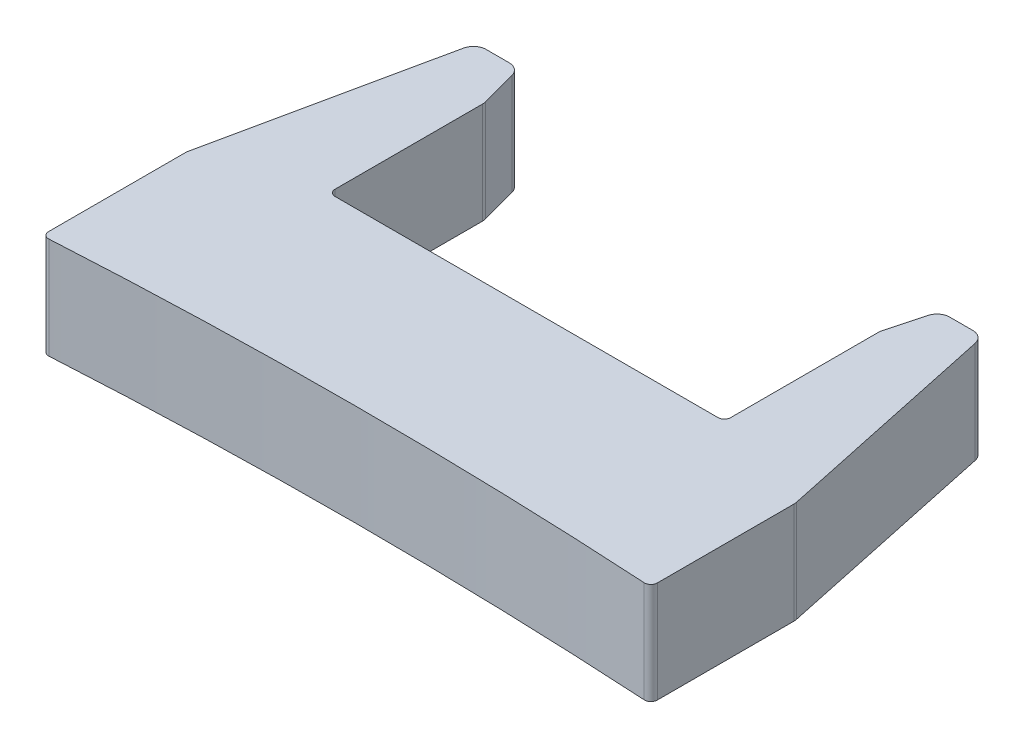
ISO-10303-21;
HEADER;
FILE_DESCRIPTION(('STEP AP214'),'2;1');
FILE_NAME('part.step','',(''),(''),'','','');
FILE_SCHEMA(('AUTOMOTIVE_DESIGN { 1 0 10303 214 1 1 1 1 }'));
ENDSEC;
DATA;
#1=APPLICATION_CONTEXT('core data for automotive mechanical design processes');
#2=APPLICATION_PROTOCOL_DEFINITION('international standard','automotive_design',2000,#1);
#3=PRODUCT_CONTEXT('',#1,'mechanical');
#4=PRODUCT('Part','Part','',(#3));
#5=PRODUCT_RELATED_PRODUCT_CATEGORY('part','',(#4));
#6=PRODUCT_DEFINITION_FORMATION('','',#4);
#7=PRODUCT_DEFINITION_CONTEXT('part definition',#1,'design');
#8=PRODUCT_DEFINITION('design','',#6,#7);
#9=PRODUCT_DEFINITION_SHAPE('','',#8);
#10=(LENGTH_UNIT() NAMED_UNIT(*) SI_UNIT(.MILLI.,.METRE.));
#11=(NAMED_UNIT(*) PLANE_ANGLE_UNIT() SI_UNIT($,.RADIAN.));
#12=(NAMED_UNIT(*) SI_UNIT($,.STERADIAN.) SOLID_ANGLE_UNIT());
#13=UNCERTAINTY_MEASURE_WITH_UNIT(LENGTH_MEASURE(1.E-05),#10,'distance_accuracy_value','');
#14=(GEOMETRIC_REPRESENTATION_CONTEXT(3) GLOBAL_UNCERTAINTY_ASSIGNED_CONTEXT((#13)) GLOBAL_UNIT_ASSIGNED_CONTEXT((#10,
#11,#12)) REPRESENTATION_CONTEXT('',''));
#15=CARTESIAN_POINT('',(0.,0.,0.));
#16=DIRECTION('',(0.,0.,1.));
#17=DIRECTION('',(1.,0.,0.));
#18=AXIS2_PLACEMENT_3D('',#15,#16,#17);
#19=CARTESIAN_POINT('',(-20.,4.,0.));
#20=DIRECTION('',(0.,0.,1.));
#21=DIRECTION('',(1.,0.,0.));
#22=AXIS2_PLACEMENT_3D('',#19,#20,#21);
#23=PLANE('',#22);
#24=CARTESIAN_POINT('',(0.,0.,0.));
#25=DIRECTION('',(0.,0.,-1.));
#26=DIRECTION('',(-1.,0.,0.));
#27=AXIS2_PLACEMENT_3D('',#24,#25,#26);
#28=CIRCLE('',#27,2.49999999999999);
#29=CARTESIAN_POINT('',(-2.49999999999999,0.,0.));
#30=VERTEX_POINT('',#29);
#31=EDGE_CURVE('E221',#30,#30,#28,.T.);
#32=ORIENTED_EDGE('',*,*,#31,.F.);
#33=EDGE_LOOP('',(#32));
#34=FACE_BOUND('',#33,.T.);
#35=DIRECTION('',(-1.,0.,0.));
#36=VECTOR('',#35,1.);
#37=CARTESIAN_POINT('',(-20.,-4.,0.));
#38=LINE('',#37,#36);
#39=CARTESIAN_POINT('',(15.1,-4.,0.));
#40=VERTEX_POINT('',#39);
#41=CARTESIAN_POINT('',(-15.1,-4.,0.));
#42=VERTEX_POINT('',#41);
#43=EDGE_CURVE('E263',#40,#42,#38,.T.);
#44=ORIENTED_EDGE('',*,*,#43,.T.);
#45=DIRECTION('',(0.,1.,0.));
#46=VECTOR('',#45,1.);
#47=CARTESIAN_POINT('',(-15.1,4.,0.));
#48=LINE('',#47,#46);
#49=CARTESIAN_POINT('',(-15.1,4.,0.));
#50=VERTEX_POINT('',#49);
#51=EDGE_CURVE('E385',#42,#50,#48,.T.);
#52=ORIENTED_EDGE('',*,*,#51,.T.);
#53=DIRECTION('',(-1.,0.,0.));
#54=VECTOR('',#53,1.);
#55=CARTESIAN_POINT('',(0.,4.,0.));
#56=LINE('',#55,#54);
#57=CARTESIAN_POINT('',(15.1,4.,0.));
#58=VERTEX_POINT('',#57);
#59=EDGE_CURVE('E269',#58,#50,#56,.T.);
#60=ORIENTED_EDGE('',*,*,#59,.F.);
#61=DIRECTION('',(0.,1.,0.));
#62=VECTOR('',#61,1.);
#63=CARTESIAN_POINT('',(15.1,4.,0.));
#64=LINE('',#63,#62);
#65=EDGE_CURVE('E383',#58,#40,#64,.F.);
#66=ORIENTED_EDGE('',*,*,#65,.T.);
#67=EDGE_LOOP('',(#44,#52,#60,#66));
#68=FACE_BOUND('',#67,.T.);
#69=ADVANCED_FACE('F48',(#34,#68),#23,.F.);
#70=CARTESIAN_POINT('',(-24.,4.,2.8));
#71=DIRECTION('',(1.,0.,0.));
#72=DIRECTION('',(0.,0.,-1.));
#73=AXIS2_PLACEMENT_3D('',#70,#71,#72);
#74=PLANE('',#73);
#75=DIRECTION('',(0.,0.,1.));
#76=VECTOR('',#75,1.);
#77=CARTESIAN_POINT('',(-24.,-4.,2.8));
#78=LINE('',#77,#76);
#79=CARTESIAN_POINT('',(-24.,-4.,2.90520551069358));
#80=VERTEX_POINT('',#79);
#81=CARTESIAN_POINT('',(-24.,-4.,13.6900451464471));
#82=VERTEX_POINT('',#81);
#83=EDGE_CURVE('E290',#80,#82,#78,.T.);
#84=ORIENTED_EDGE('',*,*,#83,.T.);
#85=DIRECTION('',(0.,-1.,0.));
#86=VECTOR('',#85,1.);
#87=CARTESIAN_POINT('',(-24.,4.,13.6900451464471));
#88=LINE('',#87,#86);
#89=CARTESIAN_POINT('',(-24.,4.,13.6900451464471));
#90=VERTEX_POINT('',#89);
#91=EDGE_CURVE('E399',#82,#90,#88,.F.);
#92=ORIENTED_EDGE('',*,*,#91,.T.);
#93=DIRECTION('',(0.,0.,1.));
#94=VECTOR('',#93,1.);
#95=CARTESIAN_POINT('',(-24.,4.,2.8));
#96=LINE('',#95,#94);
#97=CARTESIAN_POINT('',(-24.,4.,2.90520551069358));
#98=VERTEX_POINT('',#97);
#99=EDGE_CURVE('E273',#98,#90,#96,.T.);
#100=ORIENTED_EDGE('',*,*,#99,.F.);
#101=DIRECTION('',(0.,-1.,0.));
#102=VECTOR('',#101,1.);
#103=CARTESIAN_POINT('',(-24.,-4.,2.90520551069358));
#104=LINE('',#103,#102);
#105=EDGE_CURVE('E356',#98,#80,#104,.T.);
#106=ORIENTED_EDGE('',*,*,#105,.T.);
#107=EDGE_LOOP('',(#84,#92,#100,#106));
#108=FACE_BOUND('',#107,.T.);
#109=ADVANCED_FACE('F479',(#108),#74,.F.);
#110=CARTESIAN_POINT('',(0.,4.,413.5));
#111=DIRECTION('',(0.,-1.,0.));
#112=DIRECTION('',(0.,0.,-1.));
#113=AXIS2_PLACEMENT_3D('',#110,#111,#112);
#114=CYLINDRICAL_SURFACE('',#113,400.);
#115=CARTESIAN_POINT('',(0.,4.,413.5));
#116=DIRECTION('',(0.,-1.,0.));
#117=DIRECTION('',(0.,0.,-1.));
#118=AXIS2_PLACEMENT_3D('',#115,#116,#117);
#119=CIRCLE('',#118,400.);
#120=CARTESIAN_POINT('',(-23.4706616729089,4.,14.1891836668636));
#121=VERTEX_POINT('',#120);
#122=CARTESIAN_POINT('',(23.4706616729089,4.,14.1891836668636));
#123=VERTEX_POINT('',#122);
#124=EDGE_CURVE('E278',#121,#123,#119,.T.);
#125=ORIENTED_EDGE('',*,*,#124,.F.);
#126=DIRECTION('',(0.,-1.,0.));
#127=VECTOR('',#126,1.);
#128=CARTESIAN_POINT('',(-23.4706616729089,4.,14.1891836668636));
#129=LINE('',#128,#127);
#130=CARTESIAN_POINT('',(-23.4706616729089,-4.,14.1891836668636));
#131=VERTEX_POINT('',#130);
#132=EDGE_CURVE('E392',#121,#131,#129,.T.);
#133=ORIENTED_EDGE('',*,*,#132,.T.);
#134=CARTESIAN_POINT('',(0.,-4.,413.5));
#135=DIRECTION('',(0.,-1.,0.));
#136=DIRECTION('',(0.,0.,-1.));
#137=AXIS2_PLACEMENT_3D('',#134,#135,#136);
#138=CIRCLE('',#137,400.);
#139=CARTESIAN_POINT('',(23.4706616729089,-4.,14.1891836668636));
#140=VERTEX_POINT('',#139);
#141=EDGE_CURVE('E293',#131,#140,#138,.T.);
#142=ORIENTED_EDGE('',*,*,#141,.T.);
#143=DIRECTION('',(0.,-1.,0.));
#144=VECTOR('',#143,1.);
#145=CARTESIAN_POINT('',(23.4706616729089,4.,14.1891836668636));
#146=LINE('',#145,#144);
#147=EDGE_CURVE('E390',#140,#123,#146,.F.);
#148=ORIENTED_EDGE('',*,*,#147,.T.);
#149=EDGE_LOOP('',(#125,#133,#142,#148));
#150=FACE_BOUND('',#149,.T.);
#151=ADVANCED_FACE('F485',(#150),#114,.F.);
#152=CARTESIAN_POINT('',(24.,4.,2.8));
#153=DIRECTION('',(-1.,0.,0.));
#154=DIRECTION('',(0.,0.,1.));
#155=AXIS2_PLACEMENT_3D('',#152,#153,#154);
#156=PLANE('',#155);
#157=DIRECTION('',(0.,0.,-1.));
#158=VECTOR('',#157,1.);
#159=CARTESIAN_POINT('',(24.,4.,2.8));
#160=LINE('',#159,#158);
#161=CARTESIAN_POINT('',(24.,4.,13.6900451464471));
#162=VERTEX_POINT('',#161);
#163=CARTESIAN_POINT('',(24.,4.,2.90520551069359));
#164=VERTEX_POINT('',#163);
#165=EDGE_CURVE('E284',#162,#164,#160,.T.);
#166=ORIENTED_EDGE('',*,*,#165,.F.);
#167=DIRECTION('',(0.,-1.,0.));
#168=VECTOR('',#167,1.);
#169=CARTESIAN_POINT('',(24.,4.,13.6900451464471));
#170=LINE('',#169,#168);
#171=CARTESIAN_POINT('',(24.,-4.,13.6900451464471));
#172=VERTEX_POINT('',#171);
#173=EDGE_CURVE('E403',#162,#172,#170,.T.);
#174=ORIENTED_EDGE('',*,*,#173,.T.);
#175=DIRECTION('',(0.,0.,-1.));
#176=VECTOR('',#175,1.);
#177=CARTESIAN_POINT('',(24.,-4.,2.8));
#178=LINE('',#177,#176);
#179=CARTESIAN_POINT('',(24.,-4.,2.90520551069359));
#180=VERTEX_POINT('',#179);
#181=EDGE_CURVE('E274',#172,#180,#178,.T.);
#182=ORIENTED_EDGE('',*,*,#181,.T.);
#183=DIRECTION('',(0.,-1.,0.));
#184=VECTOR('',#183,1.);
#185=CARTESIAN_POINT('',(24.,4.,2.90520551069359));
#186=LINE('',#185,#184);
#187=EDGE_CURVE('E353',#180,#164,#186,.F.);
#188=ORIENTED_EDGE('',*,*,#187,.T.);
#189=EDGE_LOOP('',(#166,#174,#182,#188));
#190=FACE_BOUND('',#189,.T.);
#191=ADVANCED_FACE('F711',(#190),#156,.F.);
#192=CARTESIAN_POINT('',(0.,4.,413.5));
#193=DIRECTION('',(0.,-1.,0.));
#194=DIRECTION('',(0.,0.,-1.));
#195=AXIS2_PLACEMENT_3D('',#192,#193,#194);
#196=PLANE('',#195);
#197=ORIENTED_EDGE('',*,*,#99,.T.);
#198=CARTESIAN_POINT('',(-23.5,4.,13.6900451464471));
#199=DIRECTION('',(0.,-1.,0.));
#200=DIRECTION('',(0.,0.,-1.));
#201=AXIS2_PLACEMENT_3D('',#198,#199,#200);
#202=CIRCLE('',#201,0.5);
#203=EDGE_CURVE('E402',#90,#121,#202,.F.);
#204=ORIENTED_EDGE('',*,*,#203,.T.);
#205=ORIENTED_EDGE('',*,*,#124,.T.);
#206=CARTESIAN_POINT('',(23.5,4.,13.6900451464471));
#207=DIRECTION('',(0.,-1.,0.));
#208=DIRECTION('',(0.,0.,-1.));
#209=AXIS2_PLACEMENT_3D('',#206,#207,#208);
#210=CIRCLE('',#209,0.5);
#211=EDGE_CURVE('E63',#123,#162,#210,.F.);
#212=ORIENTED_EDGE('',*,*,#211,.T.);
#213=ORIENTED_EDGE('',*,*,#165,.T.);
#214=CARTESIAN_POINT('',(23.,4.,2.90520551069359));
#215=DIRECTION('',(0.,-1.,0.));
#216=DIRECTION('',(0.,0.,-1.));
#217=AXIS2_PLACEMENT_3D('',#214,#215,#216);
#218=CIRCLE('',#217,1.);
#219=CARTESIAN_POINT('',(23.9781059289848,4.,2.69709786622873));
#220=VERTEX_POINT('',#219);
#221=EDGE_CURVE('E326',#164,#220,#218,.F.);
#222=ORIENTED_EDGE('',*,*,#221,.T.);
#223=DIRECTION('',(-0.208107644464859,0.,-0.978105928984835));
#224=VECTOR('',#223,1.);
#225=CARTESIAN_POINT('',(20.,4.,-16.));
#226=LINE('',#225,#224);
#227=CARTESIAN_POINT('',(20.1684877352202,4.,-15.2081076444649));
#228=VERTEX_POINT('',#227);
#229=EDGE_CURVE('E220',#220,#228,#226,.T.);
#230=ORIENTED_EDGE('',*,*,#229,.T.);
#231=CARTESIAN_POINT('',(19.1903818062354,4.,-15.));
#232=DIRECTION('',(0.,-1.,0.));
#233=DIRECTION('',(0.,0.,-1.));
#234=AXIS2_PLACEMENT_3D('',#231,#232,#233);
#235=CIRCLE('',#234,1.);
#236=CARTESIAN_POINT('',(19.1903818062354,4.,-16.));
#237=VERTEX_POINT('',#236);
#238=EDGE_CURVE('E328',#228,#237,#235,.F.);
#239=ORIENTED_EDGE('',*,*,#238,.T.);
#240=DIRECTION('',(-1.,0.,0.));
#241=VECTOR('',#240,1.);
#242=CARTESIAN_POINT('',(20.,4.,-16.));
#243=LINE('',#242,#241);
#244=CARTESIAN_POINT('',(17.367326987979,4.,-16.));
#245=VERTEX_POINT('',#244);
#246=EDGE_CURVE('E224',#237,#245,#243,.T.);
#247=ORIENTED_EDGE('',*,*,#246,.T.);
#248=CARTESIAN_POINT('',(17.367326987979,4.,-15.));
#249=DIRECTION('',(0.,-1.,0.));
#250=DIRECTION('',(0.,0.,-1.));
#251=AXIS2_PLACEMENT_3D('',#248,#249,#250);
#252=CIRCLE('',#251,1.);
#253=CARTESIAN_POINT('',(16.4014011616899,4.,-15.2588190451025));
#254=VERTEX_POINT('',#253);
#255=EDGE_CURVE('E320',#245,#254,#252,.F.);
#256=ORIENTED_EDGE('',*,*,#255,.T.);
#257=DIRECTION('',(0.258819045102521,0.,-0.965925826289068));
#258=VECTOR('',#257,1.);
#259=CARTESIAN_POINT('',(16.6,4.,-16.));
#260=LINE('',#259,#258);
#261=CARTESIAN_POINT('',(15.6340741737109,4.,-12.3951157399463));
#262=VERTEX_POINT('',#261);
#263=EDGE_CURVE('E299',#254,#262,#260,.F.);
#264=ORIENTED_EDGE('',*,*,#263,.T.);
#265=CARTESIAN_POINT('',(16.6,4.,-12.1362966948437));
#266=DIRECTION('',(0.,-1.,0.));
#267=DIRECTION('',(0.,0.,-1.));
#268=AXIS2_PLACEMENT_3D('',#265,#266,#267);
#269=CIRCLE('',#268,1.);
#270=CARTESIAN_POINT('',(15.6,4.,-12.1362966948437));
#271=VERTEX_POINT('',#270);
#272=EDGE_CURVE('E318',#262,#271,#269,.F.);
#273=ORIENTED_EDGE('',*,*,#272,.T.);
#274=DIRECTION('',(0.,0.,1.));
#275=VECTOR('',#274,1.);
#276=CARTESIAN_POINT('',(15.6,4.,-16.));
#277=LINE('',#276,#275);
#278=CARTESIAN_POINT('',(15.6,4.,-0.5));
#279=VERTEX_POINT('',#278);
#280=EDGE_CURVE('E229',#271,#279,#277,.T.);
#281=ORIENTED_EDGE('',*,*,#280,.T.);
#282=CARTESIAN_POINT('',(15.1,4.,-0.5));
#283=DIRECTION('',(0.,-1.,0.));
#284=DIRECTION('',(0.,0.,-1.));
#285=AXIS2_PLACEMENT_3D('',#282,#283,#284);
#286=CIRCLE('',#285,0.5);
#287=EDGE_CURVE('E56',#279,#58,#286,.T.);
#288=ORIENTED_EDGE('',*,*,#287,.T.);
#289=ORIENTED_EDGE('',*,*,#59,.T.);
#290=CARTESIAN_POINT('',(-15.1,4.,-0.5));
#291=DIRECTION('',(0.,-1.,0.));
#292=DIRECTION('',(0.,0.,-1.));
#293=AXIS2_PLACEMENT_3D('',#290,#291,#292);
#294=CIRCLE('',#293,0.5);
#295=CARTESIAN_POINT('',(-15.6,4.,-0.5));
#296=VERTEX_POINT('',#295);
#297=EDGE_CURVE('E246',#50,#296,#294,.T.);
#298=ORIENTED_EDGE('',*,*,#297,.T.);
#299=DIRECTION('',(0.,0.,-1.));
#300=VECTOR('',#299,1.);
#301=CARTESIAN_POINT('',(-15.6,4.,-16.));
#302=LINE('',#301,#300);
#303=CARTESIAN_POINT('',(-15.6,4.,-12.1362966948437));
#304=VERTEX_POINT('',#303);
#305=EDGE_CURVE('E254',#296,#304,#302,.T.);
#306=ORIENTED_EDGE('',*,*,#305,.T.);
#307=CARTESIAN_POINT('',(-16.6,4.,-12.1362966948437));
#308=DIRECTION('',(0.,-1.,0.));
#309=DIRECTION('',(0.,0.,-1.));
#310=AXIS2_PLACEMENT_3D('',#307,#308,#309);
#311=CIRCLE('',#310,1.);
#312=CARTESIAN_POINT('',(-15.6340741737109,4.,-12.3951157399463));
#313=VERTEX_POINT('',#312);
#314=EDGE_CURVE('E316',#304,#313,#311,.F.);
#315=ORIENTED_EDGE('',*,*,#314,.T.);
#316=DIRECTION('',(0.258819045102521,0.,0.965925826289068));
#317=VECTOR('',#316,1.);
#318=CARTESIAN_POINT('',(-15.6,4.,-12.2679491924311));
#319=LINE('',#318,#317);
#320=CARTESIAN_POINT('',(-16.4014011616899,4.,-15.2588190451025));
#321=VERTEX_POINT('',#320);
#322=EDGE_CURVE('E287',#313,#321,#319,.F.);
#323=ORIENTED_EDGE('',*,*,#322,.T.);
#324=CARTESIAN_POINT('',(-17.367326987979,4.,-15.));
#325=DIRECTION('',(0.,-1.,0.));
#326=DIRECTION('',(0.,0.,-1.));
#327=AXIS2_PLACEMENT_3D('',#324,#325,#326);
#328=CIRCLE('',#327,1.);
#329=CARTESIAN_POINT('',(-17.367326987979,4.,-16.));
#330=VERTEX_POINT('',#329);
#331=EDGE_CURVE('E314',#321,#330,#328,.F.);
#332=ORIENTED_EDGE('',*,*,#331,.T.);
#333=DIRECTION('',(-1.,0.,0.));
#334=VECTOR('',#333,1.);
#335=CARTESIAN_POINT('',(-20.,4.,-16.));
#336=LINE('',#335,#334);
#337=CARTESIAN_POINT('',(-19.1903818062354,4.,-16.));
#338=VERTEX_POINT('',#337);
#339=EDGE_CURVE('E257',#330,#338,#336,.T.);
#340=ORIENTED_EDGE('',*,*,#339,.T.);
#341=CARTESIAN_POINT('',(-19.1903818062354,4.,-15.));
#342=DIRECTION('',(0.,-1.,0.));
#343=DIRECTION('',(0.,0.,-1.));
#344=AXIS2_PLACEMENT_3D('',#341,#342,#343);
#345=CIRCLE('',#344,1.);
#346=CARTESIAN_POINT('',(-20.1684877352202,4.,-15.2081076444649));
#347=VERTEX_POINT('',#346);
#348=EDGE_CURVE('E322',#338,#347,#345,.F.);
#349=ORIENTED_EDGE('',*,*,#348,.T.);
#350=DIRECTION('',(-0.208107644464859,0.,0.978105928984835));
#351=VECTOR('',#350,1.);
#352=CARTESIAN_POINT('',(-20.,4.,-16.));
#353=LINE('',#352,#351);
#354=CARTESIAN_POINT('',(-23.9781059289848,4.,2.69709786622873));
#355=VERTEX_POINT('',#354);
#356=EDGE_CURVE('E268',#347,#355,#353,.T.);
#357=ORIENTED_EDGE('',*,*,#356,.T.);
#358=CARTESIAN_POINT('',(-23.,4.,2.90520551069358));
#359=DIRECTION('',(0.,-1.,0.));
#360=DIRECTION('',(0.,0.,-1.));
#361=AXIS2_PLACEMENT_3D('',#358,#359,#360);
#362=CIRCLE('',#361,1.);
#363=EDGE_CURVE('E324',#355,#98,#362,.F.);
#364=ORIENTED_EDGE('',*,*,#363,.T.);
#365=EDGE_LOOP('',(#197,#204,#205,#212,#213,#222,#230,#239,#247,#256,#264,#273,#281,#288,#289,
#298,#306,#315,#323,#332,#340,#349,#357,#364));
#366=FACE_BOUND('',#365,.T.);
#367=ADVANCED_FACE('F414',(#366),#196,.F.);
#368=CARTESIAN_POINT('',(0.,-4.,413.5));
#369=DIRECTION('',(0.,-1.,0.));
#370=DIRECTION('',(0.,0.,-1.));
#371=AXIS2_PLACEMENT_3D('',#368,#369,#370);
#372=PLANE('',#371);
#373=ORIENTED_EDGE('',*,*,#141,.F.);
#374=CARTESIAN_POINT('',(-23.5,-4.,13.6900451464471));
#375=DIRECTION('',(0.,-1.,0.));
#376=DIRECTION('',(0.,0.,-1.));
#377=AXIS2_PLACEMENT_3D('',#374,#375,#376);
#378=CIRCLE('',#377,0.5);
#379=EDGE_CURVE('E397',#131,#82,#378,.T.);
#380=ORIENTED_EDGE('',*,*,#379,.T.);
#381=ORIENTED_EDGE('',*,*,#83,.F.);
#382=CARTESIAN_POINT('',(-23.,-4.,2.90520551069358));
#383=DIRECTION('',(0.,-1.,0.));
#384=DIRECTION('',(0.,0.,-1.));
#385=AXIS2_PLACEMENT_3D('',#382,#383,#384);
#386=CIRCLE('',#385,1.);
#387=CARTESIAN_POINT('',(-23.9781059289848,-4.,2.69709786622873));
#388=VERTEX_POINT('',#387);
#389=EDGE_CURVE('E346',#80,#388,#386,.T.);
#390=ORIENTED_EDGE('',*,*,#389,.T.);
#391=DIRECTION('',(-0.208107644464859,0.,0.978105928984835));
#392=VECTOR('',#391,1.);
#393=CARTESIAN_POINT('',(-20.,-4.,-16.));
#394=LINE('',#393,#392);
#395=CARTESIAN_POINT('',(-20.1684877352202,-4.,-15.2081076444649));
#396=VERTEX_POINT('',#395);
#397=EDGE_CURVE('E260',#396,#388,#394,.T.);
#398=ORIENTED_EDGE('',*,*,#397,.F.);
#399=CARTESIAN_POINT('',(-19.1903818062354,-4.,-15.));
#400=DIRECTION('',(0.,-1.,0.));
#401=DIRECTION('',(0.,0.,-1.));
#402=AXIS2_PLACEMENT_3D('',#399,#400,#401);
#403=CIRCLE('',#402,1.);
#404=CARTESIAN_POINT('',(-19.1903818062354,-4.,-16.));
#405=VERTEX_POINT('',#404);
#406=EDGE_CURVE('E344',#396,#405,#403,.T.);
#407=ORIENTED_EDGE('',*,*,#406,.T.);
#408=DIRECTION('',(-1.,0.,0.));
#409=VECTOR('',#408,1.);
#410=CARTESIAN_POINT('',(-20.,-4.,-16.));
#411=LINE('',#410,#409);
#412=CARTESIAN_POINT('',(-17.367326987979,-4.,-16.));
#413=VERTEX_POINT('',#412);
#414=EDGE_CURVE('E264',#413,#405,#411,.T.);
#415=ORIENTED_EDGE('',*,*,#414,.F.);
#416=CARTESIAN_POINT('',(-17.367326987979,-4.,-15.));
#417=DIRECTION('',(0.,-1.,0.));
#418=DIRECTION('',(0.,0.,-1.));
#419=AXIS2_PLACEMENT_3D('',#416,#417,#418);
#420=CIRCLE('',#419,1.);
#421=CARTESIAN_POINT('',(-16.4014011616899,-4.,-15.2588190451026));
#422=VERTEX_POINT('',#421);
#423=EDGE_CURVE('E335',#413,#422,#420,.T.);
#424=ORIENTED_EDGE('',*,*,#423,.T.);
#425=DIRECTION('',(-0.258819045102521,0.,-0.965925826289068));
#426=VECTOR('',#425,1.);
#427=CARTESIAN_POINT('',(91.8869891485892,-4.,388.878955462708));
#428=LINE('',#427,#426);
#429=CARTESIAN_POINT('',(-15.634074173711,-4.,-12.3951157399463));
#430=VERTEX_POINT('',#429);
#431=EDGE_CURVE('E302',#422,#430,#428,.F.);
#432=ORIENTED_EDGE('',*,*,#431,.T.);
#433=CARTESIAN_POINT('',(-16.6,-4.,-12.1362966948437));
#434=DIRECTION('',(0.,-1.,0.));
#435=DIRECTION('',(0.,0.,-1.));
#436=AXIS2_PLACEMENT_3D('',#433,#434,#435);
#437=CIRCLE('',#436,1.);
#438=CARTESIAN_POINT('',(-15.6,-4.,-12.1362966948437));
#439=VERTEX_POINT('',#438);
#440=EDGE_CURVE('E337',#430,#439,#437,.T.);
#441=ORIENTED_EDGE('',*,*,#440,.T.);
#442=DIRECTION('',(0.,0.,-1.));
#443=VECTOR('',#442,1.);
#444=CARTESIAN_POINT('',(-15.6,-4.,-16.));
#445=LINE('',#444,#443);
#446=CARTESIAN_POINT('',(-15.6,-4.,-0.5));
#447=VERTEX_POINT('',#446);
#448=EDGE_CURVE('E267',#447,#439,#445,.T.);
#449=ORIENTED_EDGE('',*,*,#448,.F.);
#450=CARTESIAN_POINT('',(-15.1,-4.,-0.5));
#451=DIRECTION('',(0.,-1.,0.));
#452=DIRECTION('',(0.,0.,-1.));
#453=AXIS2_PLACEMENT_3D('',#450,#451,#452);
#454=CIRCLE('',#453,0.5);
#455=EDGE_CURVE('E244',#447,#42,#454,.F.);
#456=ORIENTED_EDGE('',*,*,#455,.T.);
#457=ORIENTED_EDGE('',*,*,#43,.F.);
#458=CARTESIAN_POINT('',(15.1,-4.,-0.5));
#459=DIRECTION('',(0.,-1.,0.));
#460=DIRECTION('',(0.,0.,-1.));
#461=AXIS2_PLACEMENT_3D('',#458,#459,#460);
#462=CIRCLE('',#461,0.5);
#463=CARTESIAN_POINT('',(15.6,-4.,-0.5));
#464=VERTEX_POINT('',#463);
#465=EDGE_CURVE('E12',#40,#464,#462,.F.);
#466=ORIENTED_EDGE('',*,*,#465,.T.);
#467=DIRECTION('',(0.,0.,1.));
#468=VECTOR('',#467,1.);
#469=CARTESIAN_POINT('',(15.6,-4.,-16.));
#470=LINE('',#469,#468);
#471=CARTESIAN_POINT('',(15.6,-4.,-12.1362966948437));
#472=VERTEX_POINT('',#471);
#473=EDGE_CURVE('E258',#472,#464,#470,.T.);
#474=ORIENTED_EDGE('',*,*,#473,.F.);
#475=CARTESIAN_POINT('',(16.6,-4.,-12.1362966948437));
#476=DIRECTION('',(0.,-1.,0.));
#477=DIRECTION('',(0.,0.,-1.));
#478=AXIS2_PLACEMENT_3D('',#475,#476,#477);
#479=CIRCLE('',#478,1.);
#480=CARTESIAN_POINT('',(15.634074173711,-4.,-12.3951157399463));
#481=VERTEX_POINT('',#480);
#482=EDGE_CURVE('E340',#472,#481,#479,.T.);
#483=ORIENTED_EDGE('',*,*,#482,.T.);
#484=DIRECTION('',(-0.258819045102521,0.,0.965925826289068));
#485=VECTOR('',#484,1.);
#486=CARTESIAN_POINT('',(-91.8869891485892,-4.,388.878955462708));
#487=LINE('',#486,#485);
#488=CARTESIAN_POINT('',(16.4014011616899,-4.,-15.2588190451026));
#489=VERTEX_POINT('',#488);
#490=EDGE_CURVE('E305',#481,#489,#487,.F.);
#491=ORIENTED_EDGE('',*,*,#490,.T.);
#492=CARTESIAN_POINT('',(17.367326987979,-4.,-15.));
#493=DIRECTION('',(0.,-1.,0.));
#494=DIRECTION('',(0.,0.,-1.));
#495=AXIS2_PLACEMENT_3D('',#492,#493,#494);
#496=CIRCLE('',#495,1.);
#497=CARTESIAN_POINT('',(17.367326987979,-4.,-16.));
#498=VERTEX_POINT('',#497);
#499=EDGE_CURVE('E342',#489,#498,#496,.T.);
#500=ORIENTED_EDGE('',*,*,#499,.T.);
#501=DIRECTION('',(-1.,0.,0.));
#502=VECTOR('',#501,1.);
#503=CARTESIAN_POINT('',(20.,-4.,-16.));
#504=LINE('',#503,#502);
#505=CARTESIAN_POINT('',(19.1903818062354,-4.,-16.));
#506=VERTEX_POINT('',#505);
#507=EDGE_CURVE('E426',#506,#498,#504,.T.);
#508=ORIENTED_EDGE('',*,*,#507,.F.);
#509=CARTESIAN_POINT('',(19.1903818062354,-4.,-15.));
#510=DIRECTION('',(0.,-1.,0.));
#511=DIRECTION('',(0.,0.,-1.));
#512=AXIS2_PLACEMENT_3D('',#509,#510,#511);
#513=CIRCLE('',#512,1.);
#514=CARTESIAN_POINT('',(20.1684877352202,-4.,-15.2081076444649));
#515=VERTEX_POINT('',#514);
#516=EDGE_CURVE('E351',#506,#515,#513,.T.);
#517=ORIENTED_EDGE('',*,*,#516,.T.);
#518=DIRECTION('',(-0.208107644464859,0.,-0.978105928984835));
#519=VECTOR('',#518,1.);
#520=CARTESIAN_POINT('',(20.,-4.,-16.));
#521=LINE('',#520,#519);
#522=CARTESIAN_POINT('',(23.9781059289848,-4.,2.69709786622873));
#523=VERTEX_POINT('',#522);
#524=EDGE_CURVE('E233',#523,#515,#521,.T.);
#525=ORIENTED_EDGE('',*,*,#524,.F.);
#526=CARTESIAN_POINT('',(23.,-4.,2.90520551069359));
#527=DIRECTION('',(0.,-1.,0.));
#528=DIRECTION('',(0.,0.,-1.));
#529=AXIS2_PLACEMENT_3D('',#526,#527,#528);
#530=CIRCLE('',#529,1.);
#531=EDGE_CURVE('E348',#523,#180,#530,.T.);
#532=ORIENTED_EDGE('',*,*,#531,.T.);
#533=ORIENTED_EDGE('',*,*,#181,.F.);
#534=CARTESIAN_POINT('',(23.5,-4.,13.6900451464471));
#535=DIRECTION('',(0.,-1.,0.));
#536=DIRECTION('',(0.,0.,-1.));
#537=AXIS2_PLACEMENT_3D('',#534,#535,#536);
#538=CIRCLE('',#537,0.5);
#539=EDGE_CURVE('E395',#172,#140,#538,.T.);
#540=ORIENTED_EDGE('',*,*,#539,.T.);
#541=EDGE_LOOP('',(#373,#380,#381,#390,#398,#407,#415,#424,#432,#441,#449,#456,#457,#466,#474,
#483,#491,#500,#508,#517,#525,#532,#533,#540));
#542=FACE_BOUND('',#541,.T.);
#543=ADVANCED_FACE('F423',(#542),#372,.T.);
#544=CARTESIAN_POINT('',(-15.6,-24.591260281974,-16.));
#545=DIRECTION('',(1.,0.,0.));
#546=DIRECTION('',(0.,0.,-1.));
#547=AXIS2_PLACEMENT_3D('',#544,#545,#546);
#548=PLANE('',#547);
#549=ORIENTED_EDGE('',*,*,#305,.F.);
#550=DIRECTION('',(0.,1.,0.));
#551=VECTOR('',#550,1.);
#552=CARTESIAN_POINT('',(-15.6,-24.591260281974,-0.5));
#553=LINE('',#552,#551);
#554=EDGE_CURVE('E388',#296,#447,#553,.F.);
#555=ORIENTED_EDGE('',*,*,#554,.T.);
#556=ORIENTED_EDGE('',*,*,#448,.T.);
#557=DIRECTION('',(0.,-1.,0.));
#558=VECTOR('',#557,1.);
#559=CARTESIAN_POINT('',(-15.6,-24.591260281974,-12.1362966948437));
#560=LINE('',#559,#558);
#561=EDGE_CURVE('E376',#439,#304,#560,.F.);
#562=ORIENTED_EDGE('',*,*,#561,.T.);
#563=EDGE_LOOP('',(#549,#555,#556,#562));
#564=FACE_BOUND('',#563,.T.);
#565=ADVANCED_FACE('F467',(#564),#548,.T.);
#566=CARTESIAN_POINT('',(-20.,-24.591260281974,-16.));
#567=DIRECTION('',(0.,0.,-1.));
#568=DIRECTION('',(-1.,0.,0.));
#569=AXIS2_PLACEMENT_3D('',#566,#567,#568);
#570=PLANE('',#569);
#571=ORIENTED_EDGE('',*,*,#414,.T.);
#572=DIRECTION('',(0.,1.,0.));
#573=VECTOR('',#572,1.);
#574=CARTESIAN_POINT('',(-19.1903818062354,-24.591260281974,-16.));
#575=LINE('',#574,#573);
#576=EDGE_CURVE('E366',#405,#338,#575,.T.);
#577=ORIENTED_EDGE('',*,*,#576,.T.);
#578=ORIENTED_EDGE('',*,*,#339,.F.);
#579=DIRECTION('',(0.,1.,0.));
#580=VECTOR('',#579,1.);
#581=CARTESIAN_POINT('',(-17.367326987979,-24.591260281974,-16.));
#582=LINE('',#581,#580);
#583=EDGE_CURVE('E363',#330,#413,#582,.F.);
#584=ORIENTED_EDGE('',*,*,#583,.T.);
#585=EDGE_LOOP('',(#571,#577,#578,#584));
#586=FACE_BOUND('',#585,.T.);
#587=ADVANCED_FACE('F442',(#586),#570,.T.);
#588=CARTESIAN_POINT('',(-20.,-24.591260281974,-16.));
#589=DIRECTION('',(-0.978105928984835,0.,-0.208107644464859));
#590=DIRECTION('',(-0.208107644464859,0.,0.978105928984835));
#591=AXIS2_PLACEMENT_3D('',#588,#589,#590);
#592=PLANE('',#591);
#593=ORIENTED_EDGE('',*,*,#397,.T.);
#594=DIRECTION('',(0.,-1.,0.));
#595=VECTOR('',#594,1.);
#596=CARTESIAN_POINT('',(-23.9781059289848,4.,2.69709786622873));
#597=LINE('',#596,#595);
#598=EDGE_CURVE('E361',#388,#355,#597,.F.);
#599=ORIENTED_EDGE('',*,*,#598,.T.);
#600=ORIENTED_EDGE('',*,*,#356,.F.);
#601=DIRECTION('',(0.,1.,0.));
#602=VECTOR('',#601,1.);
#603=CARTESIAN_POINT('',(-20.1684877352202,-24.591260281974,-15.2081076444649));
#604=LINE('',#603,#602);
#605=EDGE_CURVE('E359',#347,#396,#604,.F.);
#606=ORIENTED_EDGE('',*,*,#605,.T.);
#607=EDGE_LOOP('',(#593,#599,#600,#606));
#608=FACE_BOUND('',#607,.T.);
#609=ADVANCED_FACE('F474',(#608),#592,.T.);
#610=CARTESIAN_POINT('',(20.,-24.591260281974,-16.));
#611=DIRECTION('',(0.978105928984835,0.,-0.208107644464859));
#612=DIRECTION('',(-0.208107644464859,0.,-0.978105928984835));
#613=AXIS2_PLACEMENT_3D('',#610,#611,#612);
#614=PLANE('',#613);
#615=ORIENTED_EDGE('',*,*,#524,.T.);
#616=DIRECTION('',(0.,1.,0.));
#617=VECTOR('',#616,1.);
#618=CARTESIAN_POINT('',(20.1684877352202,-24.591260281974,-15.2081076444649));
#619=LINE('',#618,#617);
#620=EDGE_CURVE('E311',#515,#228,#619,.T.);
#621=ORIENTED_EDGE('',*,*,#620,.T.);
#622=ORIENTED_EDGE('',*,*,#229,.F.);
#623=DIRECTION('',(0.,-1.,0.));
#624=VECTOR('',#623,1.);
#625=CARTESIAN_POINT('',(23.9781059289848,-4.,2.69709786622873));
#626=LINE('',#625,#624);
#627=EDGE_CURVE('E308',#220,#523,#626,.T.);
#628=ORIENTED_EDGE('',*,*,#627,.T.);
#629=EDGE_LOOP('',(#615,#621,#622,#628));
#630=FACE_BOUND('',#629,.T.);
#631=ADVANCED_FACE('F555',(#630),#614,.T.);
#632=CARTESIAN_POINT('',(20.,-24.591260281974,-16.));
#633=DIRECTION('',(0.,0.,-1.));
#634=DIRECTION('',(-1.,0.,0.));
#635=AXIS2_PLACEMENT_3D('',#632,#633,#634);
#636=PLANE('',#635);
#637=ORIENTED_EDGE('',*,*,#246,.F.);
#638=DIRECTION('',(0.,1.,0.));
#639=VECTOR('',#638,1.);
#640=CARTESIAN_POINT('',(19.1903818062354,-24.591260281974,-16.));
#641=LINE('',#640,#639);
#642=EDGE_CURVE('E333',#237,#506,#641,.F.);
#643=ORIENTED_EDGE('',*,*,#642,.T.);
#644=ORIENTED_EDGE('',*,*,#507,.T.);
#645=DIRECTION('',(0.,-1.,0.));
#646=VECTOR('',#645,1.);
#647=CARTESIAN_POINT('',(17.367326987979,-24.591260281974,-16.));
#648=LINE('',#647,#646);
#649=EDGE_CURVE('E330',#498,#245,#648,.F.);
#650=ORIENTED_EDGE('',*,*,#649,.T.);
#651=EDGE_LOOP('',(#637,#643,#644,#650));
#652=FACE_BOUND('',#651,.T.);
#653=ADVANCED_FACE('F560',(#652),#636,.T.);
#654=CARTESIAN_POINT('',(15.6,-24.591260281974,-16.));
#655=DIRECTION('',(-1.,0.,0.));
#656=DIRECTION('',(0.,0.,1.));
#657=AXIS2_PLACEMENT_3D('',#654,#655,#656);
#658=PLANE('',#657);
#659=ORIENTED_EDGE('',*,*,#473,.T.);
#660=DIRECTION('',(0.,1.,0.));
#661=VECTOR('',#660,1.);
#662=CARTESIAN_POINT('',(15.6,-24.591260281974,-0.5));
#663=LINE('',#662,#661);
#664=EDGE_CURVE('E249',#464,#279,#663,.T.);
#665=ORIENTED_EDGE('',*,*,#664,.T.);
#666=ORIENTED_EDGE('',*,*,#280,.F.);
#667=DIRECTION('',(0.,1.,0.));
#668=VECTOR('',#667,1.);
#669=CARTESIAN_POINT('',(15.6,-24.591260281974,-12.1362966948437));
#670=LINE('',#669,#668);
#671=EDGE_CURVE('E373',#271,#472,#670,.F.);
#672=ORIENTED_EDGE('',*,*,#671,.T.);
#673=EDGE_LOOP('',(#659,#665,#666,#672));
#674=FACE_BOUND('',#673,.T.);
#675=ADVANCED_FACE('F214',(#674),#658,.T.);
#676=CARTESIAN_POINT('',(0.,0.,11.));
#677=DIRECTION('',(0.,0.,-1.));
#678=DIRECTION('',(-1.,0.,0.));
#679=AXIS2_PLACEMENT_3D('',#676,#677,#678);
#680=CONICAL_SURFACE('',#679,2.5,1.02974425867665);
#681=CARTESIAN_POINT('',(0.,0.,12.5021515475689));
#682=VERTEX_POINT('',#681);
#683=VERTEX_LOOP('',#682);
#684=FACE_BOUND('',#683,.T.);
#685=CARTESIAN_POINT('',(0.,0.,11.));
#686=DIRECTION('',(0.,0.,-1.));
#687=DIRECTION('',(-1.,0.,0.));
#688=AXIS2_PLACEMENT_3D('',#685,#686,#687);
#689=CIRCLE('',#688,2.5);
#690=CARTESIAN_POINT('',(-2.5,0.,11.));
#691=VERTEX_POINT('',#690);
#692=EDGE_CURVE('E218',#691,#691,#689,.T.);
#693=ORIENTED_EDGE('',*,*,#692,.T.);
#694=EDGE_LOOP('',(#693));
#695=FACE_BOUND('',#694,.T.);
#696=ADVANCED_FACE('F210',(#684,#695),#680,.F.);
#697=CARTESIAN_POINT('',(0.,0.,0.));
#698=DIRECTION('',(0.,0.,-1.));
#699=DIRECTION('',(-1.,0.,0.));
#700=AXIS2_PLACEMENT_3D('',#697,#698,#699);
#701=CYLINDRICAL_SURFACE('',#700,2.49999999999999);
#702=ORIENTED_EDGE('',*,*,#692,.F.);
#703=EDGE_LOOP('',(#702));
#704=FACE_BOUND('',#703,.T.);
#705=ORIENTED_EDGE('',*,*,#31,.T.);
#706=EDGE_LOOP('',(#705));
#707=FACE_BOUND('',#706,.T.);
#708=ADVANCED_FACE('F213',(#704,#707),#701,.F.);
#709=CARTESIAN_POINT('',(16.6,-24.591260281974,-16.));
#710=DIRECTION('',(0.965925826289068,0.,0.258819045102521));
#711=DIRECTION('',(0.,1.,0.));
#712=AXIS2_PLACEMENT_3D('',#709,#710,#711);
#713=PLANE('',#712);
#714=ORIENTED_EDGE('',*,*,#263,.F.);
#715=DIRECTION('',(0.,1.,0.));
#716=VECTOR('',#715,1.);
#717=CARTESIAN_POINT('',(16.4014011616899,-24.591260281974,-15.2588190451025));
#718=LINE('',#717,#716);
#719=EDGE_CURVE('E371',#254,#489,#718,.F.);
#720=ORIENTED_EDGE('',*,*,#719,.T.);
#721=ORIENTED_EDGE('',*,*,#490,.F.);
#722=DIRECTION('',(0.,-1.,0.));
#723=VECTOR('',#722,1.);
#724=CARTESIAN_POINT('',(15.6340741737109,-24.591260281974,-12.3951157399463));
#725=LINE('',#724,#723);
#726=EDGE_CURVE('E369',#481,#262,#725,.F.);
#727=ORIENTED_EDGE('',*,*,#726,.T.);
#728=EDGE_LOOP('',(#714,#720,#721,#727));
#729=FACE_BOUND('',#728,.T.);
#730=ADVANCED_FACE('F492',(#729),#713,.F.);
#731=CARTESIAN_POINT('',(-15.6,-24.591260281974,-12.2679491924311));
#732=DIRECTION('',(-0.965925826289068,0.,0.258819045102521));
#733=DIRECTION('',(0.,1.,0.));
#734=AXIS2_PLACEMENT_3D('',#731,#732,#733);
#735=PLANE('',#734);
#736=ORIENTED_EDGE('',*,*,#322,.F.);
#737=DIRECTION('',(0.,1.,0.));
#738=VECTOR('',#737,1.);
#739=CARTESIAN_POINT('',(-15.6340741737109,-24.591260281974,-12.3951157399463));
#740=LINE('',#739,#738);
#741=EDGE_CURVE('E381',#313,#430,#740,.F.);
#742=ORIENTED_EDGE('',*,*,#741,.T.);
#743=ORIENTED_EDGE('',*,*,#431,.F.);
#744=DIRECTION('',(0.,-1.,0.));
#745=VECTOR('',#744,1.);
#746=CARTESIAN_POINT('',(-16.4014011616899,-24.591260281974,-15.2588190451025));
#747=LINE('',#746,#745);
#748=EDGE_CURVE('E379',#422,#321,#747,.F.);
#749=ORIENTED_EDGE('',*,*,#748,.T.);
#750=EDGE_LOOP('',(#736,#742,#743,#749));
#751=FACE_BOUND('',#750,.T.);
#752=ADVANCED_FACE('F452',(#751),#735,.F.);
#753=CARTESIAN_POINT('',(19.1903818062354,-24.591260281974,-15.));
#754=DIRECTION('',(0.,1.,0.));
#755=DIRECTION('',(0.,0.,1.));
#756=AXIS2_PLACEMENT_3D('',#753,#754,#755);
#757=CYLINDRICAL_SURFACE('',#756,1.);
#758=ORIENTED_EDGE('',*,*,#516,.F.);
#759=ORIENTED_EDGE('',*,*,#642,.F.);
#760=ORIENTED_EDGE('',*,*,#238,.F.);
#761=ORIENTED_EDGE('',*,*,#620,.F.);
#762=EDGE_LOOP('',(#758,#759,#760,#761));
#763=FACE_BOUND('',#762,.T.);
#764=ADVANCED_FACE('F503',(#763),#757,.T.);
#765=CARTESIAN_POINT('',(23.,-24.591260281974,2.90520551069359));
#766=DIRECTION('',(0.,1.,0.));
#767=DIRECTION('',(0.,0.,1.));
#768=AXIS2_PLACEMENT_3D('',#765,#766,#767);
#769=CYLINDRICAL_SURFACE('',#768,1.);
#770=ORIENTED_EDGE('',*,*,#221,.F.);
#771=ORIENTED_EDGE('',*,*,#187,.F.);
#772=ORIENTED_EDGE('',*,*,#531,.F.);
#773=ORIENTED_EDGE('',*,*,#627,.F.);
#774=EDGE_LOOP('',(#770,#771,#772,#773));
#775=FACE_BOUND('',#774,.T.);
#776=ADVANCED_FACE('F506',(#775),#769,.T.);
#777=CARTESIAN_POINT('',(-23.,4.,2.90520551069358));
#778=DIRECTION('',(0.,1.,0.));
#779=DIRECTION('',(0.,0.,1.));
#780=AXIS2_PLACEMENT_3D('',#777,#778,#779);
#781=CYLINDRICAL_SURFACE('',#780,1.);
#782=ORIENTED_EDGE('',*,*,#363,.F.);
#783=ORIENTED_EDGE('',*,*,#598,.F.);
#784=ORIENTED_EDGE('',*,*,#389,.F.);
#785=ORIENTED_EDGE('',*,*,#105,.F.);
#786=EDGE_LOOP('',(#782,#783,#784,#785));
#787=FACE_BOUND('',#786,.T.);
#788=ADVANCED_FACE('F510',(#787),#781,.T.);
#789=CARTESIAN_POINT('',(-19.1903818062354,-24.591260281974,-15.));
#790=DIRECTION('',(0.,1.,0.));
#791=DIRECTION('',(0.,0.,1.));
#792=AXIS2_PLACEMENT_3D('',#789,#790,#791);
#793=CYLINDRICAL_SURFACE('',#792,1.);
#794=ORIENTED_EDGE('',*,*,#406,.F.);
#795=ORIENTED_EDGE('',*,*,#605,.F.);
#796=ORIENTED_EDGE('',*,*,#348,.F.);
#797=ORIENTED_EDGE('',*,*,#576,.F.);
#798=EDGE_LOOP('',(#794,#795,#796,#797));
#799=FACE_BOUND('',#798,.T.);
#800=ADVANCED_FACE('F514',(#799),#793,.T.);
#801=CARTESIAN_POINT('',(17.367326987979,-24.591260281974,-15.));
#802=DIRECTION('',(0.,-1.,0.));
#803=DIRECTION('',(0.,0.,-1.));
#804=AXIS2_PLACEMENT_3D('',#801,#802,#803);
#805=CYLINDRICAL_SURFACE('',#804,1.);
#806=ORIENTED_EDGE('',*,*,#499,.F.);
#807=ORIENTED_EDGE('',*,*,#719,.F.);
#808=ORIENTED_EDGE('',*,*,#255,.F.);
#809=ORIENTED_EDGE('',*,*,#649,.F.);
#810=EDGE_LOOP('',(#806,#807,#808,#809));
#811=FACE_BOUND('',#810,.T.);
#812=ADVANCED_FACE('F518',(#811),#805,.T.);
#813=CARTESIAN_POINT('',(16.6,-24.591260281974,-12.1362966948437));
#814=DIRECTION('',(0.,1.,0.));
#815=DIRECTION('',(0.,0.,1.));
#816=AXIS2_PLACEMENT_3D('',#813,#814,#815);
#817=CYLINDRICAL_SURFACE('',#816,1.);
#818=ORIENTED_EDGE('',*,*,#272,.F.);
#819=ORIENTED_EDGE('',*,*,#726,.F.);
#820=ORIENTED_EDGE('',*,*,#482,.F.);
#821=ORIENTED_EDGE('',*,*,#671,.F.);
#822=EDGE_LOOP('',(#818,#819,#820,#821));
#823=FACE_BOUND('',#822,.T.);
#824=ADVANCED_FACE('F420',(#823),#817,.T.);
#825=CARTESIAN_POINT('',(-16.6,-24.591260281974,-12.1362966948437));
#826=DIRECTION('',(0.,-1.,0.));
#827=DIRECTION('',(0.,0.,-1.));
#828=AXIS2_PLACEMENT_3D('',#825,#826,#827);
#829=CYLINDRICAL_SURFACE('',#828,1.);
#830=ORIENTED_EDGE('',*,*,#440,.F.);
#831=ORIENTED_EDGE('',*,*,#741,.F.);
#832=ORIENTED_EDGE('',*,*,#314,.F.);
#833=ORIENTED_EDGE('',*,*,#561,.F.);
#834=EDGE_LOOP('',(#830,#831,#832,#833));
#835=FACE_BOUND('',#834,.T.);
#836=ADVANCED_FACE('F456',(#835),#829,.T.);
#837=CARTESIAN_POINT('',(-17.367326987979,-24.591260281974,-15.));
#838=DIRECTION('',(0.,1.,0.));
#839=DIRECTION('',(0.,0.,1.));
#840=AXIS2_PLACEMENT_3D('',#837,#838,#839);
#841=CYLINDRICAL_SURFACE('',#840,1.);
#842=ORIENTED_EDGE('',*,*,#331,.F.);
#843=ORIENTED_EDGE('',*,*,#748,.F.);
#844=ORIENTED_EDGE('',*,*,#423,.F.);
#845=ORIENTED_EDGE('',*,*,#583,.F.);
#846=EDGE_LOOP('',(#842,#843,#844,#845));
#847=FACE_BOUND('',#846,.T.);
#848=ADVANCED_FACE('F446',(#847),#841,.T.);
#849=CARTESIAN_POINT('',(-15.1,4.,-0.5));
#850=DIRECTION('',(0.,1.,0.));
#851=DIRECTION('',(0.,0.,1.));
#852=AXIS2_PLACEMENT_3D('',#849,#850,#851);
#853=CYLINDRICAL_SURFACE('',#852,0.5);
#854=ORIENTED_EDGE('',*,*,#455,.F.);
#855=ORIENTED_EDGE('',*,*,#554,.F.);
#856=ORIENTED_EDGE('',*,*,#297,.F.);
#857=ORIENTED_EDGE('',*,*,#51,.F.);
#858=EDGE_LOOP('',(#854,#855,#856,#857));
#859=FACE_BOUND('',#858,.T.);
#860=ADVANCED_FACE('F464',(#859),#853,.F.);
#861=CARTESIAN_POINT('',(-23.5,4.,13.6900451464471));
#862=DIRECTION('',(0.,-1.,0.));
#863=DIRECTION('',(0.,0.,-1.));
#864=AXIS2_PLACEMENT_3D('',#861,#862,#863);
#865=CYLINDRICAL_SURFACE('',#864,0.5);
#866=ORIENTED_EDGE('',*,*,#203,.F.);
#867=ORIENTED_EDGE('',*,*,#91,.F.);
#868=ORIENTED_EDGE('',*,*,#379,.F.);
#869=ORIENTED_EDGE('',*,*,#132,.F.);
#870=EDGE_LOOP('',(#866,#867,#868,#869));
#871=FACE_BOUND('',#870,.T.);
#872=ADVANCED_FACE('F531',(#871),#865,.T.);
#873=CARTESIAN_POINT('',(23.5,4.,13.6900451464471));
#874=DIRECTION('',(0.,-1.,0.));
#875=DIRECTION('',(0.,0.,-1.));
#876=AXIS2_PLACEMENT_3D('',#873,#874,#875);
#877=CYLINDRICAL_SURFACE('',#876,0.5);
#878=ORIENTED_EDGE('',*,*,#211,.F.);
#879=ORIENTED_EDGE('',*,*,#147,.F.);
#880=ORIENTED_EDGE('',*,*,#539,.F.);
#881=ORIENTED_EDGE('',*,*,#173,.F.);
#882=EDGE_LOOP('',(#878,#879,#880,#881));
#883=FACE_BOUND('',#882,.T.);
#884=ADVANCED_FACE('F533',(#883),#877,.T.);
#885=CARTESIAN_POINT('',(15.1,-24.591260281974,-0.5));
#886=DIRECTION('',(0.,1.,0.));
#887=DIRECTION('',(0.,0.,1.));
#888=AXIS2_PLACEMENT_3D('',#885,#886,#887);
#889=CYLINDRICAL_SURFACE('',#888,0.5);
#890=ORIENTED_EDGE('',*,*,#465,.F.);
#891=ORIENTED_EDGE('',*,*,#65,.F.);
#892=ORIENTED_EDGE('',*,*,#287,.F.);
#893=ORIENTED_EDGE('',*,*,#664,.F.);
#894=EDGE_LOOP('',(#890,#891,#892,#893));
#895=FACE_BOUND('',#894,.T.);
#896=ADVANCED_FACE('F50',(#895),#889,.F.);
#897=CLOSED_SHELL('',(#69,#109,#151,#191,#367,#543,#565,#587,#609,#631,#653,#675,#696,#708,#730,
#752,#764,#776,#788,#800,#812,#824,#836,#848,#860,#872,#884,#896));
#898=MANIFOLD_SOLID_BREP('B2',#897);
#899=ADVANCED_BREP_SHAPE_REPRESENTATION('',(#18,#898),#14);
#900=SHAPE_DEFINITION_REPRESENTATION(#9,#899);
ENDSEC;
END-ISO-10303-21;
